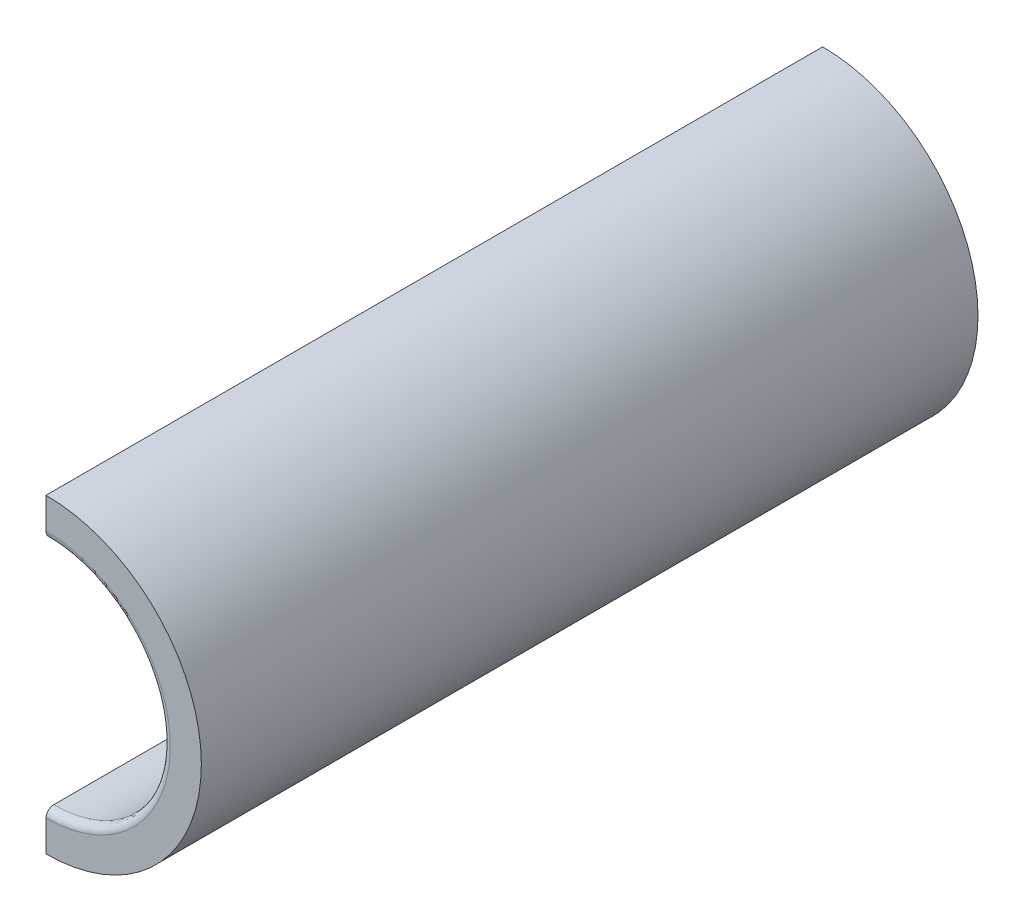
ISO-10303-21;
HEADER;
FILE_DESCRIPTION(('STEP AP214'),'2;1');
FILE_NAME('part.step','',(''),(''),'','','');
FILE_SCHEMA(('AUTOMOTIVE_DESIGN { 1 0 10303 214 1 1 1 1 }'));
ENDSEC;
DATA;
#1=APPLICATION_CONTEXT('core data for automotive mechanical design processes');
#2=APPLICATION_PROTOCOL_DEFINITION('international standard','automotive_design',2000,#1);
#3=PRODUCT_CONTEXT('',#1,'mechanical');
#4=PRODUCT('Part','Part','',(#3));
#5=PRODUCT_RELATED_PRODUCT_CATEGORY('part','',(#4));
#6=PRODUCT_DEFINITION_FORMATION('','',#4);
#7=PRODUCT_DEFINITION_CONTEXT('part definition',#1,'design');
#8=PRODUCT_DEFINITION('design','',#6,#7);
#9=PRODUCT_DEFINITION_SHAPE('','',#8);
#10=(LENGTH_UNIT() NAMED_UNIT(*) SI_UNIT(.MILLI.,.METRE.));
#11=(NAMED_UNIT(*) PLANE_ANGLE_UNIT() SI_UNIT($,.RADIAN.));
#12=(NAMED_UNIT(*) SI_UNIT($,.STERADIAN.) SOLID_ANGLE_UNIT());
#13=UNCERTAINTY_MEASURE_WITH_UNIT(LENGTH_MEASURE(1.E-05),#10,'distance_accuracy_value','');
#14=(GEOMETRIC_REPRESENTATION_CONTEXT(3) GLOBAL_UNCERTAINTY_ASSIGNED_CONTEXT((#13)) GLOBAL_UNIT_ASSIGNED_CONTEXT((#10,
#11,#12)) REPRESENTATION_CONTEXT('',''));
#15=CARTESIAN_POINT('',(0.,0.,0.));
#16=DIRECTION('',(0.,0.,1.));
#17=DIRECTION('',(1.,0.,0.));
#18=AXIS2_PLACEMENT_3D('',#15,#16,#17);
#19=CARTESIAN_POINT('',(0.,0.,100.));
#20=DIRECTION('',(0.,0.,-1.));
#21=DIRECTION('',(-1.,0.,0.));
#22=AXIS2_PLACEMENT_3D('',#19,#20,#21);
#23=CYLINDRICAL_SURFACE('',#22,40.);
#24=CARTESIAN_POINT('',(0.,0.,-100.));
#25=DIRECTION('',(0.,0.,1.));
#26=DIRECTION('',(1.,0.,0.));
#27=AXIS2_PLACEMENT_3D('',#24,#25,#26);
#28=CIRCLE('',#27,40.);
#29=CARTESIAN_POINT('',(0.,-40.,-100.));
#30=VERTEX_POINT('',#29);
#31=CARTESIAN_POINT('',(0.,40.,-100.));
#32=VERTEX_POINT('',#31);
#33=EDGE_CURVE('E121',#30,#32,#28,.T.);
#34=ORIENTED_EDGE('',*,*,#33,.T.);
#35=DIRECTION('',(0.,0.,-1.));
#36=VECTOR('',#35,1.);
#37=CARTESIAN_POINT('',(0.,40.,100.));
#38=LINE('',#37,#36);
#39=CARTESIAN_POINT('',(0.,40.,100.));
#40=VERTEX_POINT('',#39);
#41=EDGE_CURVE('E103',#40,#32,#38,.T.);
#42=ORIENTED_EDGE('',*,*,#41,.F.);
#43=CARTESIAN_POINT('',(0.,0.,100.));
#44=DIRECTION('',(0.,0.,1.));
#45=DIRECTION('',(1.,0.,0.));
#46=AXIS2_PLACEMENT_3D('',#43,#44,#45);
#47=CIRCLE('',#46,40.);
#48=CARTESIAN_POINT('',(0.,-40.,100.));
#49=VERTEX_POINT('',#48);
#50=EDGE_CURVE('E109',#49,#40,#47,.T.);
#51=ORIENTED_EDGE('',*,*,#50,.F.);
#52=DIRECTION('',(0.,0.,-1.));
#53=VECTOR('',#52,1.);
#54=CARTESIAN_POINT('',(0.,-40.,100.));
#55=LINE('',#54,#53);
#56=EDGE_CURVE('E167',#49,#30,#55,.T.);
#57=ORIENTED_EDGE('',*,*,#56,.T.);
#58=EDGE_LOOP('',(#34,#42,#51,#57));
#59=FACE_BOUND('',#58,.T.);
#60=ADVANCED_FACE('F45',(#59),#23,.T.);
#61=CARTESIAN_POINT('',(0.,40.,100.));
#62=DIRECTION('',(1.,0.,0.));
#63=DIRECTION('',(0.,0.,-1.));
#64=AXIS2_PLACEMENT_3D('',#61,#62,#63);
#65=PLANE('',#64);
#66=DIRECTION('',(0.,-1.,0.));
#67=VECTOR('',#66,1.);
#68=CARTESIAN_POINT('',(0.,40.,-100.));
#69=LINE('',#68,#67);
#70=CARTESIAN_POINT('',(0.,32.,-100.));
#71=VERTEX_POINT('',#70);
#72=EDGE_CURVE('E149',#32,#71,#69,.T.);
#73=ORIENTED_EDGE('',*,*,#72,.T.);
#74=CARTESIAN_POINT('',(0.,32.,-98.));
#75=DIRECTION('',(1.,0.,0.));
#76=DIRECTION('',(0.,0.,-1.));
#77=AXIS2_PLACEMENT_3D('',#74,#75,#76);
#78=CIRCLE('',#77,2.);
#79=CARTESIAN_POINT('',(0.,30.,-98.));
#80=VERTEX_POINT('',#79);
#81=EDGE_CURVE('E54',#71,#80,#78,.F.);
#82=ORIENTED_EDGE('',*,*,#81,.T.);
#83=DIRECTION('',(0.,0.,-1.));
#84=VECTOR('',#83,1.);
#85=CARTESIAN_POINT('',(0.,30.,100.));
#86=LINE('',#85,#84);
#87=CARTESIAN_POINT('',(0.,30.,98.));
#88=VERTEX_POINT('',#87);
#89=EDGE_CURVE('E124',#88,#80,#86,.T.);
#90=ORIENTED_EDGE('',*,*,#89,.F.);
#91=CARTESIAN_POINT('',(0.,32.,98.));
#92=DIRECTION('',(1.,0.,0.));
#93=DIRECTION('',(0.,0.,-1.));
#94=AXIS2_PLACEMENT_3D('',#91,#92,#93);
#95=CIRCLE('',#94,2.);
#96=CARTESIAN_POINT('',(0.,32.,100.));
#97=VERTEX_POINT('',#96);
#98=EDGE_CURVE('E61',#88,#97,#95,.F.);
#99=ORIENTED_EDGE('',*,*,#98,.T.);
#100=DIRECTION('',(0.,-1.,0.));
#101=VECTOR('',#100,1.);
#102=CARTESIAN_POINT('',(0.,40.,100.));
#103=LINE('',#102,#101);
#104=EDGE_CURVE('E99',#40,#97,#103,.T.);
#105=ORIENTED_EDGE('',*,*,#104,.F.);
#106=ORIENTED_EDGE('',*,*,#41,.T.);
#107=EDGE_LOOP('',(#73,#82,#90,#99,#105,#106));
#108=FACE_BOUND('',#107,.T.);
#109=ADVANCED_FACE('F101',(#108),#65,.F.);
#110=CARTESIAN_POINT('',(0.,0.,100.));
#111=DIRECTION('',(0.,0.,-1.));
#112=DIRECTION('',(-1.,0.,0.));
#113=AXIS2_PLACEMENT_3D('',#110,#111,#112);
#114=CYLINDRICAL_SURFACE('',#113,30.);
#115=ORIENTED_EDGE('',*,*,#89,.T.);
#116=CARTESIAN_POINT('',(0.,0.,-98.));
#117=DIRECTION('',(0.,0.,1.));
#118=DIRECTION('',(1.,0.,0.));
#119=AXIS2_PLACEMENT_3D('',#116,#117,#118);
#120=CIRCLE('',#119,30.);
#121=CARTESIAN_POINT('',(0.,-30.,-98.));
#122=VERTEX_POINT('',#121);
#123=EDGE_CURVE('E128',#80,#122,#120,.F.);
#124=ORIENTED_EDGE('',*,*,#123,.T.);
#125=DIRECTION('',(0.,0.,-1.));
#126=VECTOR('',#125,1.);
#127=CARTESIAN_POINT('',(0.,-30.,100.));
#128=LINE('',#127,#126);
#129=CARTESIAN_POINT('',(0.,-30.,98.));
#130=VERTEX_POINT('',#129);
#131=EDGE_CURVE('E131',#130,#122,#128,.T.);
#132=ORIENTED_EDGE('',*,*,#131,.F.);
#133=CARTESIAN_POINT('',(0.,0.,98.));
#134=DIRECTION('',(0.,0.,1.));
#135=DIRECTION('',(1.,0.,0.));
#136=AXIS2_PLACEMENT_3D('',#133,#134,#135);
#137=CIRCLE('',#136,30.);
#138=EDGE_CURVE('E123',#130,#88,#137,.T.);
#139=ORIENTED_EDGE('',*,*,#138,.T.);
#140=EDGE_LOOP('',(#115,#124,#132,#139));
#141=FACE_BOUND('',#140,.T.);
#142=ADVANCED_FACE('F153',(#141),#114,.F.);
#143=CARTESIAN_POINT('',(0.,-30.,100.));
#144=DIRECTION('',(1.,0.,0.));
#145=DIRECTION('',(0.,0.,-1.));
#146=AXIS2_PLACEMENT_3D('',#143,#144,#145);
#147=PLANE('',#146);
#148=ORIENTED_EDGE('',*,*,#131,.T.);
#149=CARTESIAN_POINT('',(0.,-32.,-98.));
#150=DIRECTION('',(1.,0.,0.));
#151=DIRECTION('',(0.,0.,-1.));
#152=AXIS2_PLACEMENT_3D('',#149,#150,#151);
#153=CIRCLE('',#152,2.);
#154=CARTESIAN_POINT('',(0.,-32.,-100.));
#155=VERTEX_POINT('',#154);
#156=EDGE_CURVE('E141',#122,#155,#153,.F.);
#157=ORIENTED_EDGE('',*,*,#156,.T.);
#158=DIRECTION('',(0.,-1.,0.));
#159=VECTOR('',#158,1.);
#160=CARTESIAN_POINT('',(0.,-30.,-100.));
#161=LINE('',#160,#159);
#162=EDGE_CURVE('E118',#155,#30,#161,.T.);
#163=ORIENTED_EDGE('',*,*,#162,.T.);
#164=ORIENTED_EDGE('',*,*,#56,.F.);
#165=DIRECTION('',(0.,-1.,0.));
#166=VECTOR('',#165,1.);
#167=CARTESIAN_POINT('',(0.,-30.,100.));
#168=LINE('',#167,#166);
#169=CARTESIAN_POINT('',(0.,-32.,100.));
#170=VERTEX_POINT('',#169);
#171=EDGE_CURVE('E108',#170,#49,#168,.T.);
#172=ORIENTED_EDGE('',*,*,#171,.F.);
#173=CARTESIAN_POINT('',(0.,-32.,98.));
#174=DIRECTION('',(1.,0.,0.));
#175=DIRECTION('',(0.,0.,-1.));
#176=AXIS2_PLACEMENT_3D('',#173,#174,#175);
#177=CIRCLE('',#176,2.);
#178=EDGE_CURVE('E138',#170,#130,#177,.F.);
#179=ORIENTED_EDGE('',*,*,#178,.T.);
#180=EDGE_LOOP('',(#148,#157,#163,#164,#172,#179));
#181=FACE_BOUND('',#180,.T.);
#182=ADVANCED_FACE('F159',(#181),#147,.F.);
#183=CARTESIAN_POINT('',(0.,0.,100.));
#184=DIRECTION('',(0.,0.,1.));
#185=DIRECTION('',(1.,0.,0.));
#186=AXIS2_PLACEMENT_3D('',#183,#184,#185);
#187=PLANE('',#186);
#188=ORIENTED_EDGE('',*,*,#104,.T.);
#189=CARTESIAN_POINT('',(0.,0.,100.));
#190=DIRECTION('',(0.,0.,1.));
#191=DIRECTION('',(1.,0.,0.));
#192=AXIS2_PLACEMENT_3D('',#189,#190,#191);
#193=CIRCLE('',#192,32.);
#194=EDGE_CURVE('E11',#97,#170,#193,.F.);
#195=ORIENTED_EDGE('',*,*,#194,.T.);
#196=ORIENTED_EDGE('',*,*,#171,.T.);
#197=ORIENTED_EDGE('',*,*,#50,.T.);
#198=EDGE_LOOP('',(#188,#195,#196,#197));
#199=FACE_BOUND('',#198,.T.);
#200=ADVANCED_FACE('F112',(#199),#187,.T.);
#201=CARTESIAN_POINT('',(0.,0.,-100.));
#202=DIRECTION('',(0.,0.,1.));
#203=DIRECTION('',(1.,0.,0.));
#204=AXIS2_PLACEMENT_3D('',#201,#202,#203);
#205=PLANE('',#204);
#206=ORIENTED_EDGE('',*,*,#162,.F.);
#207=CARTESIAN_POINT('',(0.,0.,-100.));
#208=DIRECTION('',(0.,0.,1.));
#209=DIRECTION('',(1.,0.,0.));
#210=AXIS2_PLACEMENT_3D('',#207,#208,#209);
#211=CIRCLE('',#210,32.);
#212=EDGE_CURVE('E69',#155,#71,#211,.T.);
#213=ORIENTED_EDGE('',*,*,#212,.T.);
#214=ORIENTED_EDGE('',*,*,#72,.F.);
#215=ORIENTED_EDGE('',*,*,#33,.F.);
#216=EDGE_LOOP('',(#206,#213,#214,#215));
#217=FACE_BOUND('',#216,.T.);
#218=ADVANCED_FACE('F160',(#217),#205,.F.);
#219=CARTESIAN_POINT('',(0.,0.,-98.));
#220=DIRECTION('',(0.,0.,1.));
#221=DIRECTION('',(1.,0.,0.));
#222=AXIS2_PLACEMENT_3D('',#219,#220,#221);
#223=TOROIDAL_SURFACE('',#222,32.,2.);
#224=ORIENTED_EDGE('',*,*,#81,.F.);
#225=ORIENTED_EDGE('',*,*,#212,.F.);
#226=ORIENTED_EDGE('',*,*,#156,.F.);
#227=ORIENTED_EDGE('',*,*,#123,.F.);
#228=EDGE_LOOP('',(#224,#225,#226,#227));
#229=FACE_BOUND('',#228,.T.);
#230=ADVANCED_FACE('F157',(#229),#223,.T.);
#231=CARTESIAN_POINT('',(0.,0.,98.));
#232=DIRECTION('',(0.,0.,1.));
#233=DIRECTION('',(1.,0.,0.));
#234=AXIS2_PLACEMENT_3D('',#231,#232,#233);
#235=TOROIDAL_SURFACE('',#234,32.,2.);
#236=ORIENTED_EDGE('',*,*,#98,.F.);
#237=ORIENTED_EDGE('',*,*,#138,.F.);
#238=ORIENTED_EDGE('',*,*,#178,.F.);
#239=ORIENTED_EDGE('',*,*,#194,.F.);
#240=EDGE_LOOP('',(#236,#237,#238,#239));
#241=FACE_BOUND('',#240,.T.);
#242=ADVANCED_FACE('F47',(#241),#235,.T.);
#243=CLOSED_SHELL('',(#60,#109,#142,#182,#200,#218,#230,#242));
#244=MANIFOLD_SOLID_BREP('B2',#243);
#245=ADVANCED_BREP_SHAPE_REPRESENTATION('',(#18,#244),#14);
#246=SHAPE_DEFINITION_REPRESENTATION(#9,#245);
ENDSEC;
END-ISO-10303-21;
